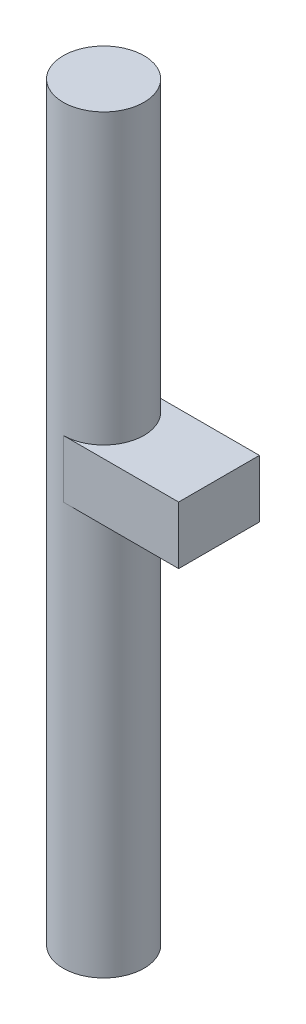
ISO-10303-21;
HEADER;
FILE_DESCRIPTION(('STEP AP214'),'2;1');
FILE_NAME('part.step','',(''),(''),'','','');
FILE_SCHEMA(('AUTOMOTIVE_DESIGN { 1 0 10303 214 1 1 1 1 }'));
ENDSEC;
DATA;
#1=APPLICATION_CONTEXT('core data for automotive mechanical design processes');
#2=APPLICATION_PROTOCOL_DEFINITION('international standard','automotive_design',2000,#1);
#3=PRODUCT_CONTEXT('',#1,'mechanical');
#4=PRODUCT('Part','Part','',(#3));
#5=PRODUCT_RELATED_PRODUCT_CATEGORY('part','',(#4));
#6=PRODUCT_DEFINITION_FORMATION('','',#4);
#7=PRODUCT_DEFINITION_CONTEXT('part definition',#1,'design');
#8=PRODUCT_DEFINITION('design','',#6,#7);
#9=PRODUCT_DEFINITION_SHAPE('','',#8);
#10=(LENGTH_UNIT() NAMED_UNIT(*) SI_UNIT(.MILLI.,.METRE.));
#11=(NAMED_UNIT(*) PLANE_ANGLE_UNIT() SI_UNIT($,.RADIAN.));
#12=(NAMED_UNIT(*) SI_UNIT($,.STERADIAN.) SOLID_ANGLE_UNIT());
#13=UNCERTAINTY_MEASURE_WITH_UNIT(LENGTH_MEASURE(1.E-05),#10,'distance_accuracy_value','');
#14=(GEOMETRIC_REPRESENTATION_CONTEXT(3) GLOBAL_UNCERTAINTY_ASSIGNED_CONTEXT((#13)) GLOBAL_UNIT_ASSIGNED_CONTEXT((#10,
#11,#12)) REPRESENTATION_CONTEXT('',''));
#15=CARTESIAN_POINT('',(0.,0.,0.));
#16=DIRECTION('',(0.,0.,1.));
#17=DIRECTION('',(1.,0.,0.));
#18=AXIS2_PLACEMENT_3D('',#15,#16,#17);
#19=CARTESIAN_POINT('',(0.,33.02,0.));
#20=DIRECTION('',(0.,-1.,0.));
#21=DIRECTION('',(0.,0.,-1.));
#22=AXIS2_PLACEMENT_3D('',#19,#20,#21);
#23=CYLINDRICAL_SURFACE('',#22,1.778);
#24=CARTESIAN_POINT('',(0.,0.,0.));
#25=DIRECTION('',(0.,1.,0.));
#26=DIRECTION('',(0.,0.,1.));
#27=AXIS2_PLACEMENT_3D('',#24,#25,#26);
#28=CIRCLE('',#27,1.778);
#29=CARTESIAN_POINT('',(0.,0.,1.778));
#30=VERTEX_POINT('',#29);
#31=EDGE_CURVE('E108',#30,#30,#28,.T.);
#32=ORIENTED_EDGE('',*,*,#31,.T.);
#33=EDGE_LOOP('',(#32));
#34=FACE_BOUND('',#33,.T.);
#35=CARTESIAN_POINT('',(0.,33.02,0.));
#36=DIRECTION('',(0.,1.,0.));
#37=DIRECTION('',(0.,0.,1.));
#38=AXIS2_PLACEMENT_3D('',#35,#36,#37);
#39=CIRCLE('',#38,1.778);
#40=CARTESIAN_POINT('',(0.,33.02,1.778));
#41=VERTEX_POINT('',#40);
#42=EDGE_CURVE('E113',#41,#41,#39,.T.);
#43=ORIENTED_EDGE('',*,*,#42,.F.);
#44=EDGE_LOOP('',(#43));
#45=FACE_BOUND('',#44,.T.);
#46=CARTESIAN_POINT('',(0.,20.32,0.));
#47=DIRECTION('',(0.,-1.,0.));
#48=DIRECTION('',(0.,0.,-1.));
#49=AXIS2_PLACEMENT_3D('',#46,#47,#48);
#50=CIRCLE('',#49,1.778);
#51=CARTESIAN_POINT('',(0.,20.32,-1.778));
#52=VERTEX_POINT('',#51);
#53=CARTESIAN_POINT('',(0.,20.32,1.778));
#54=VERTEX_POINT('',#53);
#55=EDGE_CURVE('E11',#52,#54,#50,.T.);
#56=ORIENTED_EDGE('',*,*,#55,.F.);
#57=DIRECTION('',(0.,1.,0.));
#58=VECTOR('',#57,1.);
#59=CARTESIAN_POINT('',(0.,20.32,-1.778));
#60=LINE('',#59,#58);
#61=CARTESIAN_POINT('',(0.,17.78,-1.778));
#62=VERTEX_POINT('',#61);
#63=EDGE_CURVE('E106',#62,#52,#60,.T.);
#64=ORIENTED_EDGE('',*,*,#63,.F.);
#65=CARTESIAN_POINT('',(0.,17.78,0.));
#66=DIRECTION('',(0.,1.,0.));
#67=DIRECTION('',(0.,0.,1.));
#68=AXIS2_PLACEMENT_3D('',#65,#66,#67);
#69=CIRCLE('',#68,1.778);
#70=CARTESIAN_POINT('',(0.,17.78,1.778));
#71=VERTEX_POINT('',#70);
#72=EDGE_CURVE('E53',#71,#62,#69,.T.);
#73=ORIENTED_EDGE('',*,*,#72,.F.);
#74=DIRECTION('',(0.,-1.,0.));
#75=VECTOR('',#74,1.);
#76=CARTESIAN_POINT('',(0.,20.32,1.778));
#77=LINE('',#76,#75);
#78=EDGE_CURVE('E60',#54,#71,#77,.T.);
#79=ORIENTED_EDGE('',*,*,#78,.F.);
#80=EDGE_LOOP('',(#56,#64,#73,#79));
#81=FACE_BOUND('',#80,.T.);
#82=ADVANCED_FACE('F45',(#34,#45,#81),#23,.T.);
#83=CARTESIAN_POINT('',(0.,33.02,0.));
#84=DIRECTION('',(0.,1.,0.));
#85=DIRECTION('',(0.,0.,1.));
#86=AXIS2_PLACEMENT_3D('',#83,#84,#85);
#87=PLANE('',#86);
#88=ORIENTED_EDGE('',*,*,#42,.T.);
#89=EDGE_LOOP('',(#88));
#90=FACE_BOUND('',#89,.T.);
#91=ADVANCED_FACE('F149',(#90),#87,.T.);
#92=CARTESIAN_POINT('',(0.,0.,0.));
#93=DIRECTION('',(0.,1.,0.));
#94=DIRECTION('',(0.,0.,1.));
#95=AXIS2_PLACEMENT_3D('',#92,#93,#94);
#96=PLANE('',#95);
#97=ORIENTED_EDGE('',*,*,#31,.F.);
#98=EDGE_LOOP('',(#97));
#99=FACE_BOUND('',#98,.T.);
#100=ADVANCED_FACE('F156',(#99),#96,.F.);
#101=CARTESIAN_POINT('',(5.08,20.32,-1.778));
#102=DIRECTION('',(0.,0.,1.));
#103=DIRECTION('',(1.,0.,0.));
#104=AXIS2_PLACEMENT_3D('',#101,#102,#103);
#105=PLANE('',#104);
#106=ORIENTED_EDGE('',*,*,#63,.T.);
#107=DIRECTION('',(-1.,0.,0.));
#108=VECTOR('',#107,1.);
#109=CARTESIAN_POINT('',(5.08,20.32,-1.778));
#110=LINE('',#109,#108);
#111=CARTESIAN_POINT('',(5.08,20.32,-1.778));
#112=VERTEX_POINT('',#111);
#113=EDGE_CURVE('E86',#112,#52,#110,.T.);
#114=ORIENTED_EDGE('',*,*,#113,.F.);
#115=DIRECTION('',(0.,1.,0.));
#116=VECTOR('',#115,1.);
#117=CARTESIAN_POINT('',(5.08,20.32,-1.778));
#118=LINE('',#117,#116);
#119=CARTESIAN_POINT('',(5.08,17.78,-1.778));
#120=VERTEX_POINT('',#119);
#121=EDGE_CURVE('E94',#120,#112,#118,.T.);
#122=ORIENTED_EDGE('',*,*,#121,.F.);
#123=DIRECTION('',(-1.,0.,0.));
#124=VECTOR('',#123,1.);
#125=CARTESIAN_POINT('',(5.08,17.78,-1.778));
#126=LINE('',#125,#124);
#127=EDGE_CURVE('E125',#120,#62,#126,.T.);
#128=ORIENTED_EDGE('',*,*,#127,.T.);
#129=EDGE_LOOP('',(#106,#114,#122,#128));
#130=FACE_BOUND('',#129,.T.);
#131=ADVANCED_FACE('F105',(#130),#105,.F.);
#132=CARTESIAN_POINT('',(5.08,20.32,1.778));
#133=DIRECTION('',(0.,-1.,0.));
#134=DIRECTION('',(0.,0.,-1.));
#135=AXIS2_PLACEMENT_3D('',#132,#133,#134);
#136=PLANE('',#135);
#137=ORIENTED_EDGE('',*,*,#113,.T.);
#138=ORIENTED_EDGE('',*,*,#55,.T.);
#139=DIRECTION('',(-1.,0.,0.));
#140=VECTOR('',#139,1.);
#141=CARTESIAN_POINT('',(5.08,20.32,1.778));
#142=LINE('',#141,#140);
#143=CARTESIAN_POINT('',(5.08,20.32,1.778));
#144=VERTEX_POINT('',#143);
#145=EDGE_CURVE('E89',#144,#54,#142,.T.);
#146=ORIENTED_EDGE('',*,*,#145,.F.);
#147=DIRECTION('',(0.,0.,1.));
#148=VECTOR('',#147,1.);
#149=CARTESIAN_POINT('',(5.08,20.32,1.778));
#150=LINE('',#149,#148);
#151=EDGE_CURVE('E82',#112,#144,#150,.T.);
#152=ORIENTED_EDGE('',*,*,#151,.F.);
#153=EDGE_LOOP('',(#137,#138,#146,#152));
#154=FACE_BOUND('',#153,.T.);
#155=ADVANCED_FACE('F84',(#154),#136,.F.);
#156=CARTESIAN_POINT('',(5.08,20.32,1.778));
#157=DIRECTION('',(0.,0.,-1.));
#158=DIRECTION('',(-1.,0.,0.));
#159=AXIS2_PLACEMENT_3D('',#156,#157,#158);
#160=PLANE('',#159);
#161=ORIENTED_EDGE('',*,*,#78,.T.);
#162=DIRECTION('',(-1.,0.,0.));
#163=VECTOR('',#162,1.);
#164=CARTESIAN_POINT('',(5.08,17.78,1.778));
#165=LINE('',#164,#163);
#166=CARTESIAN_POINT('',(5.08,17.78,1.778));
#167=VERTEX_POINT('',#166);
#168=EDGE_CURVE('E115',#167,#71,#165,.T.);
#169=ORIENTED_EDGE('',*,*,#168,.F.);
#170=DIRECTION('',(0.,-1.,0.));
#171=VECTOR('',#170,1.);
#172=CARTESIAN_POINT('',(5.08,20.32,1.778));
#173=LINE('',#172,#171);
#174=EDGE_CURVE('E93',#144,#167,#173,.T.);
#175=ORIENTED_EDGE('',*,*,#174,.F.);
#176=ORIENTED_EDGE('',*,*,#145,.T.);
#177=EDGE_LOOP('',(#161,#169,#175,#176));
#178=FACE_BOUND('',#177,.T.);
#179=ADVANCED_FACE('F139',(#178),#160,.F.);
#180=CARTESIAN_POINT('',(5.08,17.78,1.778));
#181=DIRECTION('',(0.,1.,0.));
#182=DIRECTION('',(0.,0.,1.));
#183=AXIS2_PLACEMENT_3D('',#180,#181,#182);
#184=PLANE('',#183);
#185=ORIENTED_EDGE('',*,*,#168,.T.);
#186=ORIENTED_EDGE('',*,*,#72,.T.);
#187=ORIENTED_EDGE('',*,*,#127,.F.);
#188=DIRECTION('',(0.,0.,-1.));
#189=VECTOR('',#188,1.);
#190=CARTESIAN_POINT('',(5.08,17.78,1.778));
#191=LINE('',#190,#189);
#192=EDGE_CURVE('E99',#167,#120,#191,.T.);
#193=ORIENTED_EDGE('',*,*,#192,.F.);
#194=EDGE_LOOP('',(#185,#186,#187,#193));
#195=FACE_BOUND('',#194,.T.);
#196=ADVANCED_FACE('F124',(#195),#184,.F.);
#197=CARTESIAN_POINT('',(5.08,0.,0.));
#198=DIRECTION('',(1.,0.,0.));
#199=DIRECTION('',(0.,0.,-1.));
#200=AXIS2_PLACEMENT_3D('',#197,#198,#199);
#201=PLANE('',#200);
#202=ORIENTED_EDGE('',*,*,#121,.T.);
#203=ORIENTED_EDGE('',*,*,#151,.T.);
#204=ORIENTED_EDGE('',*,*,#174,.T.);
#205=ORIENTED_EDGE('',*,*,#192,.T.);
#206=EDGE_LOOP('',(#202,#203,#204,#205));
#207=FACE_BOUND('',#206,.T.);
#208=ADVANCED_FACE('F97',(#207),#201,.T.);
#209=CLOSED_SHELL('',(#82,#91,#100,#131,#155,#179,#196,#208));
#210=MANIFOLD_SOLID_BREP('B2',#209);
#211=ADVANCED_BREP_SHAPE_REPRESENTATION('',(#18,#210),#14);
#212=SHAPE_DEFINITION_REPRESENTATION(#9,#211);
ENDSEC;
END-ISO-10303-21;
